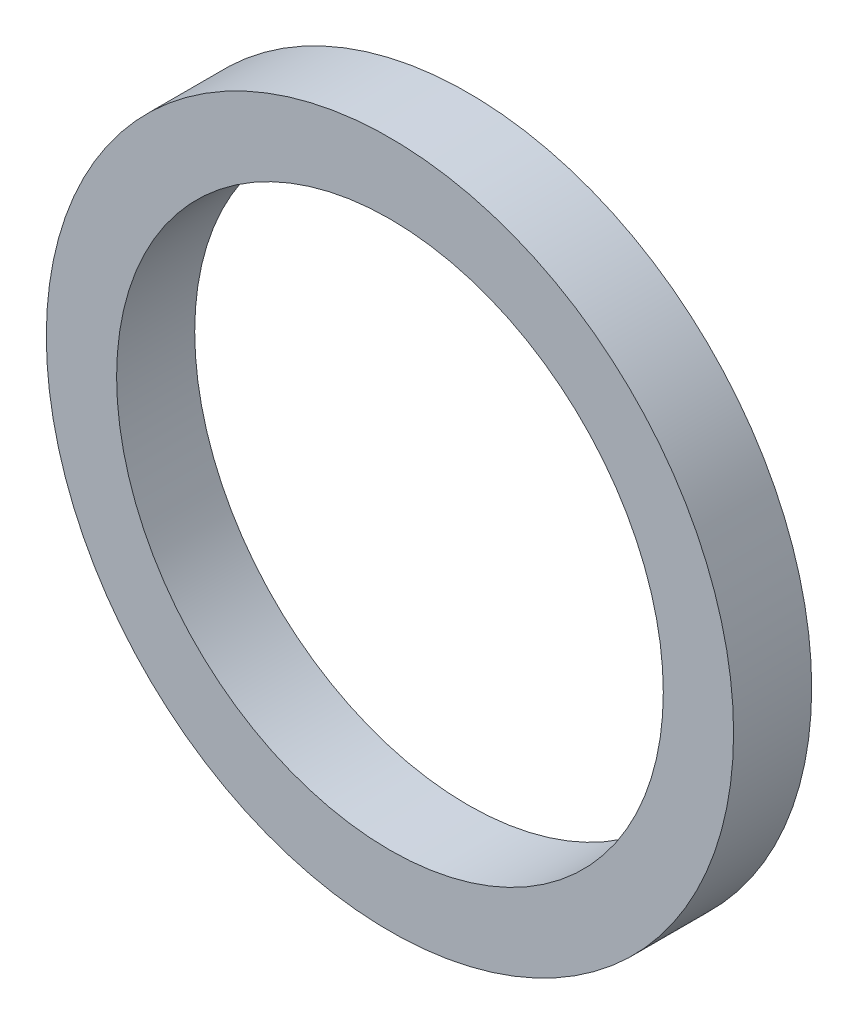
ISO-10303-21;
HEADER;
FILE_DESCRIPTION(('STEP AP214'),'2;1');
FILE_NAME('part.step','',(''),(''),'','','');
FILE_SCHEMA(('AUTOMOTIVE_DESIGN { 1 0 10303 214 1 1 1 1 }'));
ENDSEC;
DATA;
#1=APPLICATION_CONTEXT('core data for automotive mechanical design processes');
#2=APPLICATION_PROTOCOL_DEFINITION('international standard','automotive_design',2000,#1);
#3=PRODUCT_CONTEXT('',#1,'mechanical');
#4=PRODUCT('Part','Part','',(#3));
#5=PRODUCT_RELATED_PRODUCT_CATEGORY('part','',(#4));
#6=PRODUCT_DEFINITION_FORMATION('','',#4);
#7=PRODUCT_DEFINITION_CONTEXT('part definition',#1,'design');
#8=PRODUCT_DEFINITION('design','',#6,#7);
#9=PRODUCT_DEFINITION_SHAPE('','',#8);
#10=(LENGTH_UNIT() NAMED_UNIT(*) SI_UNIT(.MILLI.,.METRE.));
#11=(NAMED_UNIT(*) PLANE_ANGLE_UNIT() SI_UNIT($,.RADIAN.));
#12=(NAMED_UNIT(*) SI_UNIT($,.STERADIAN.) SOLID_ANGLE_UNIT());
#13=UNCERTAINTY_MEASURE_WITH_UNIT(LENGTH_MEASURE(1.E-05),#10,'distance_accuracy_value','');
#14=(GEOMETRIC_REPRESENTATION_CONTEXT(3) GLOBAL_UNCERTAINTY_ASSIGNED_CONTEXT((#13)) GLOBAL_UNIT_ASSIGNED_CONTEXT((#10,
#11,#12)) REPRESENTATION_CONTEXT('',''));
#15=CARTESIAN_POINT('',(0.,0.,0.));
#16=DIRECTION('',(0.,0.,1.));
#17=DIRECTION('',(1.,0.,0.));
#18=AXIS2_PLACEMENT_3D('',#15,#16,#17);
#19=CARTESIAN_POINT('',(0.,0.,1.25));
#20=DIRECTION('',(0.,0.,1.));
#21=DIRECTION('',(1.,0.,0.));
#22=AXIS2_PLACEMENT_3D('',#19,#20,#21);
#23=PLANE('',#22);
#24=CARTESIAN_POINT('',(0.,0.,1.25));
#25=DIRECTION('',(0.,0.,1.));
#26=DIRECTION('',(1.,0.,0.));
#27=AXIS2_PLACEMENT_3D('',#24,#25,#26);
#28=CIRCLE('',#27,11.);
#29=CARTESIAN_POINT('',(11.,0.,1.25));
#30=VERTEX_POINT('',#29);
#31=EDGE_CURVE('E10',#30,#30,#28,.T.);
#32=ORIENTED_EDGE('',*,*,#31,.T.);
#33=EDGE_LOOP('',(#32));
#34=FACE_BOUND('',#33,.T.);
#35=CARTESIAN_POINT('',(0.,0.,1.25));
#36=DIRECTION('',(0.,0.,1.));
#37=DIRECTION('',(1.,0.,0.));
#38=AXIS2_PLACEMENT_3D('',#35,#36,#37);
#39=CIRCLE('',#38,8.75);
#40=CARTESIAN_POINT('',(8.75,0.,1.25));
#41=VERTEX_POINT('',#40);
#42=EDGE_CURVE('E41',#41,#41,#39,.T.);
#43=ORIENTED_EDGE('',*,*,#42,.F.);
#44=EDGE_LOOP('',(#43));
#45=FACE_BOUND('',#44,.T.);
#46=ADVANCED_FACE('F30',(#34,#45),#23,.T.);
#47=CARTESIAN_POINT('',(0.,0.,-1.25));
#48=DIRECTION('',(0.,0.,1.));
#49=DIRECTION('',(1.,0.,0.));
#50=AXIS2_PLACEMENT_3D('',#47,#48,#49);
#51=PLANE('',#50);
#52=CARTESIAN_POINT('',(0.,0.,-1.25));
#53=DIRECTION('',(0.,0.,1.));
#54=DIRECTION('',(1.,0.,0.));
#55=AXIS2_PLACEMENT_3D('',#52,#53,#54);
#56=CIRCLE('',#55,11.);
#57=CARTESIAN_POINT('',(11.,0.,-1.25));
#58=VERTEX_POINT('',#57);
#59=EDGE_CURVE('E34',#58,#58,#56,.T.);
#60=ORIENTED_EDGE('',*,*,#59,.F.);
#61=EDGE_LOOP('',(#60));
#62=FACE_BOUND('',#61,.T.);
#63=CARTESIAN_POINT('',(0.,0.,-1.25));
#64=DIRECTION('',(0.,0.,1.));
#65=DIRECTION('',(1.,0.,0.));
#66=AXIS2_PLACEMENT_3D('',#63,#64,#65);
#67=CIRCLE('',#66,8.75);
#68=CARTESIAN_POINT('',(8.75,0.,-1.25));
#69=VERTEX_POINT('',#68);
#70=EDGE_CURVE('E43',#69,#69,#67,.T.);
#71=ORIENTED_EDGE('',*,*,#70,.T.);
#72=EDGE_LOOP('',(#71));
#73=FACE_BOUND('',#72,.T.);
#74=ADVANCED_FACE('F53',(#62,#73),#51,.F.);
#75=CARTESIAN_POINT('',(0.,0.,1.25));
#76=DIRECTION('',(0.,0.,-1.));
#77=DIRECTION('',(-1.,0.,0.));
#78=AXIS2_PLACEMENT_3D('',#75,#76,#77);
#79=CYLINDRICAL_SURFACE('',#78,11.);
#80=ORIENTED_EDGE('',*,*,#31,.F.);
#81=EDGE_LOOP('',(#80));
#82=FACE_BOUND('',#81,.T.);
#83=ORIENTED_EDGE('',*,*,#59,.T.);
#84=EDGE_LOOP('',(#83));
#85=FACE_BOUND('',#84,.T.);
#86=ADVANCED_FACE('F32',(#82,#85),#79,.T.);
#87=CARTESIAN_POINT('',(0.,0.,1.25));
#88=DIRECTION('',(0.,0.,-1.));
#89=DIRECTION('',(-1.,0.,0.));
#90=AXIS2_PLACEMENT_3D('',#87,#88,#89);
#91=CYLINDRICAL_SURFACE('',#90,8.75);
#92=ORIENTED_EDGE('',*,*,#42,.T.);
#93=EDGE_LOOP('',(#92));
#94=FACE_BOUND('',#93,.T.);
#95=ORIENTED_EDGE('',*,*,#70,.F.);
#96=EDGE_LOOP('',(#95));
#97=FACE_BOUND('',#96,.T.);
#98=ADVANCED_FACE('F49',(#94,#97),#91,.F.);
#99=CLOSED_SHELL('',(#46,#74,#86,#98));
#100=MANIFOLD_SOLID_BREP('B2',#99);
#101=ADVANCED_BREP_SHAPE_REPRESENTATION('',(#18,#100),#14);
#102=SHAPE_DEFINITION_REPRESENTATION(#9,#101);
ENDSEC;
END-ISO-10303-21;
